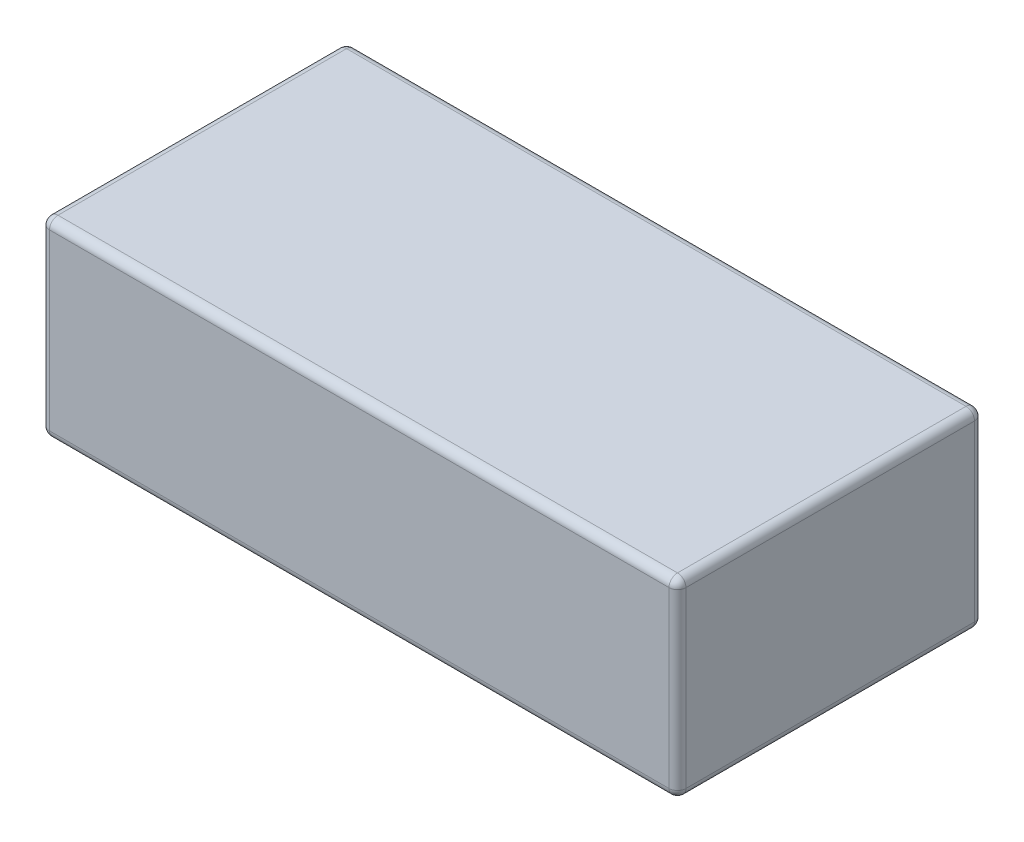
ISO-10303-21;
HEADER;
FILE_DESCRIPTION(('STEP AP214'),'2;1');
FILE_NAME('part.step','',(''),(''),'','','');
FILE_SCHEMA(('AUTOMOTIVE_DESIGN { 1 0 10303 214 1 1 1 1 }'));
ENDSEC;
DATA;
#1=APPLICATION_CONTEXT('core data for automotive mechanical design processes');
#2=APPLICATION_PROTOCOL_DEFINITION('international standard','automotive_design',2000,#1);
#3=PRODUCT_CONTEXT('',#1,'mechanical');
#4=PRODUCT('Part','Part','',(#3));
#5=PRODUCT_RELATED_PRODUCT_CATEGORY('part','',(#4));
#6=PRODUCT_DEFINITION_FORMATION('','',#4);
#7=PRODUCT_DEFINITION_CONTEXT('part definition',#1,'design');
#8=PRODUCT_DEFINITION('design','',#6,#7);
#9=PRODUCT_DEFINITION_SHAPE('','',#8);
#10=(LENGTH_UNIT() NAMED_UNIT(*) SI_UNIT(.MILLI.,.METRE.));
#11=(NAMED_UNIT(*) PLANE_ANGLE_UNIT() SI_UNIT($,.RADIAN.));
#12=(NAMED_UNIT(*) SI_UNIT($,.STERADIAN.) SOLID_ANGLE_UNIT());
#13=UNCERTAINTY_MEASURE_WITH_UNIT(LENGTH_MEASURE(1.E-05),#10,'distance_accuracy_value','');
#14=(GEOMETRIC_REPRESENTATION_CONTEXT(3) GLOBAL_UNCERTAINTY_ASSIGNED_CONTEXT((#13)) GLOBAL_UNIT_ASSIGNED_CONTEXT((#10,
#11,#12)) REPRESENTATION_CONTEXT('',''));
#15=CARTESIAN_POINT('',(0.,0.,0.));
#16=DIRECTION('',(0.,0.,1.));
#17=DIRECTION('',(1.,0.,0.));
#18=AXIS2_PLACEMENT_3D('',#15,#16,#17);
#19=CARTESIAN_POINT('',(75.,45.,36.));
#20=DIRECTION('',(-1.,0.,0.));
#21=DIRECTION('',(0.,0.,1.));
#22=AXIS2_PLACEMENT_3D('',#19,#20,#21);
#23=PLANE('',#22);
#24=DIRECTION('',(0.,0.,-1.));
#25=VECTOR('',#24,1.);
#26=CARTESIAN_POINT('',(75.,2.,-36.));
#27=LINE('',#26,#25);
#28=CARTESIAN_POINT('',(75.,2.,34.));
#29=VERTEX_POINT('',#28);
#30=CARTESIAN_POINT('',(75.,2.,-34.));
#31=VERTEX_POINT('',#30);
#32=EDGE_CURVE('E188',#29,#31,#27,.T.);
#33=ORIENTED_EDGE('',*,*,#32,.T.);
#34=DIRECTION('',(0.,-1.,0.));
#35=VECTOR('',#34,1.);
#36=CARTESIAN_POINT('',(75.,45.,-34.));
#37=LINE('',#36,#35);
#38=CARTESIAN_POINT('',(75.,43.,-34.));
#39=VERTEX_POINT('',#38);
#40=EDGE_CURVE('E190',#31,#39,#37,.F.);
#41=ORIENTED_EDGE('',*,*,#40,.T.);
#42=DIRECTION('',(0.,0.,-1.));
#43=VECTOR('',#42,1.);
#44=CARTESIAN_POINT('',(75.,43.,36.));
#45=LINE('',#44,#43);
#46=CARTESIAN_POINT('',(75.,43.,34.));
#47=VERTEX_POINT('',#46);
#48=EDGE_CURVE('E184',#39,#47,#45,.F.);
#49=ORIENTED_EDGE('',*,*,#48,.T.);
#50=DIRECTION('',(0.,-1.,0.));
#51=VECTOR('',#50,1.);
#52=CARTESIAN_POINT('',(75.,45.,34.));
#53=LINE('',#52,#51);
#54=EDGE_CURVE('E186',#47,#29,#53,.T.);
#55=ORIENTED_EDGE('',*,*,#54,.T.);
#56=EDGE_LOOP('',(#33,#41,#49,#55));
#57=FACE_BOUND('',#56,.T.);
#58=ADVANCED_FACE('F35',(#57),#23,.F.);
#59=CARTESIAN_POINT('',(-75.,45.,-36.));
#60=DIRECTION('',(0.,0.,1.));
#61=DIRECTION('',(1.,0.,0.));
#62=AXIS2_PLACEMENT_3D('',#59,#60,#61);
#63=PLANE('',#62);
#64=DIRECTION('',(-1.,0.,0.));
#65=VECTOR('',#64,1.);
#66=CARTESIAN_POINT('',(-75.,2.,-36.));
#67=LINE('',#66,#65);
#68=CARTESIAN_POINT('',(73.,2.,-36.));
#69=VERTEX_POINT('',#68);
#70=CARTESIAN_POINT('',(-73.,2.,-36.));
#71=VERTEX_POINT('',#70);
#72=EDGE_CURVE('E170',#69,#71,#67,.T.);
#73=ORIENTED_EDGE('',*,*,#72,.T.);
#74=DIRECTION('',(0.,-1.,0.));
#75=VECTOR('',#74,1.);
#76=CARTESIAN_POINT('',(-73.,45.,-36.));
#77=LINE('',#76,#75);
#78=CARTESIAN_POINT('',(-73.,43.,-36.));
#79=VERTEX_POINT('',#78);
#80=EDGE_CURVE('E172',#71,#79,#77,.F.);
#81=ORIENTED_EDGE('',*,*,#80,.T.);
#82=DIRECTION('',(-1.,0.,0.));
#83=VECTOR('',#82,1.);
#84=CARTESIAN_POINT('',(-75.,43.,-36.));
#85=LINE('',#84,#83);
#86=CARTESIAN_POINT('',(73.,43.,-36.));
#87=VERTEX_POINT('',#86);
#88=EDGE_CURVE('E166',#79,#87,#85,.F.);
#89=ORIENTED_EDGE('',*,*,#88,.T.);
#90=DIRECTION('',(0.,-1.,0.));
#91=VECTOR('',#90,1.);
#92=CARTESIAN_POINT('',(73.,45.,-36.));
#93=LINE('',#92,#91);
#94=EDGE_CURVE('E168',#87,#69,#93,.T.);
#95=ORIENTED_EDGE('',*,*,#94,.T.);
#96=EDGE_LOOP('',(#73,#81,#89,#95));
#97=FACE_BOUND('',#96,.T.);
#98=ADVANCED_FACE('F309',(#97),#63,.F.);
#99=CARTESIAN_POINT('',(-75.,45.,36.));
#100=DIRECTION('',(1.,0.,0.));
#101=DIRECTION('',(0.,0.,-1.));
#102=AXIS2_PLACEMENT_3D('',#99,#100,#101);
#103=PLANE('',#102);
#104=DIRECTION('',(0.,0.,1.));
#105=VECTOR('',#104,1.);
#106=CARTESIAN_POINT('',(-75.,43.,36.));
#107=LINE('',#106,#105);
#108=CARTESIAN_POINT('',(-75.,43.,34.));
#109=VERTEX_POINT('',#108);
#110=CARTESIAN_POINT('',(-75.,43.,-34.));
#111=VERTEX_POINT('',#110);
#112=EDGE_CURVE('E128',#109,#111,#107,.F.);
#113=ORIENTED_EDGE('',*,*,#112,.T.);
#114=DIRECTION('',(0.,-1.,0.));
#115=VECTOR('',#114,1.);
#116=CARTESIAN_POINT('',(-75.,45.,-34.));
#117=LINE('',#116,#115);
#118=CARTESIAN_POINT('',(-75.,2.,-34.));
#119=VERTEX_POINT('',#118);
#120=EDGE_CURVE('E164',#111,#119,#117,.T.);
#121=ORIENTED_EDGE('',*,*,#120,.T.);
#122=DIRECTION('',(0.,0.,1.));
#123=VECTOR('',#122,1.);
#124=CARTESIAN_POINT('',(-75.,2.,36.));
#125=LINE('',#124,#123);
#126=CARTESIAN_POINT('',(-75.,2.,34.));
#127=VERTEX_POINT('',#126);
#128=EDGE_CURVE('E131',#119,#127,#125,.T.);
#129=ORIENTED_EDGE('',*,*,#128,.T.);
#130=DIRECTION('',(0.,-1.,0.));
#131=VECTOR('',#130,1.);
#132=CARTESIAN_POINT('',(-75.,45.,34.));
#133=LINE('',#132,#131);
#134=EDGE_CURVE('E123',#127,#109,#133,.F.);
#135=ORIENTED_EDGE('',*,*,#134,.T.);
#136=EDGE_LOOP('',(#113,#121,#129,#135));
#137=FACE_BOUND('',#136,.T.);
#138=ADVANCED_FACE('F125',(#137),#103,.F.);
#139=CARTESIAN_POINT('',(-75.,45.,36.));
#140=DIRECTION('',(0.,0.,-1.));
#141=DIRECTION('',(-1.,0.,0.));
#142=AXIS2_PLACEMENT_3D('',#139,#140,#141);
#143=PLANE('',#142);
#144=DIRECTION('',(0.,-1.,0.));
#145=VECTOR('',#144,1.);
#146=CARTESIAN_POINT('',(-73.,45.,36.));
#147=LINE('',#146,#145);
#148=CARTESIAN_POINT('',(-73.,43.,36.));
#149=VERTEX_POINT('',#148);
#150=CARTESIAN_POINT('',(-73.,2.,36.));
#151=VERTEX_POINT('',#150);
#152=EDGE_CURVE('E141',#149,#151,#147,.T.);
#153=ORIENTED_EDGE('',*,*,#152,.T.);
#154=DIRECTION('',(1.,0.,0.));
#155=VECTOR('',#154,1.);
#156=CARTESIAN_POINT('',(75.,2.,36.));
#157=LINE('',#156,#155);
#158=CARTESIAN_POINT('',(73.,2.,36.));
#159=VERTEX_POINT('',#158);
#160=EDGE_CURVE('E199',#151,#159,#157,.T.);
#161=ORIENTED_EDGE('',*,*,#160,.T.);
#162=DIRECTION('',(0.,-1.,0.));
#163=VECTOR('',#162,1.);
#164=CARTESIAN_POINT('',(73.,45.,36.));
#165=LINE('',#164,#163);
#166=CARTESIAN_POINT('',(73.,43.,36.));
#167=VERTEX_POINT('',#166);
#168=EDGE_CURVE('E196',#159,#167,#165,.F.);
#169=ORIENTED_EDGE('',*,*,#168,.T.);
#170=DIRECTION('',(1.,0.,0.));
#171=VECTOR('',#170,1.);
#172=CARTESIAN_POINT('',(-75.,43.,36.));
#173=LINE('',#172,#171);
#174=EDGE_CURVE('E193',#167,#149,#173,.F.);
#175=ORIENTED_EDGE('',*,*,#174,.T.);
#176=EDGE_LOOP('',(#153,#161,#169,#175));
#177=FACE_BOUND('',#176,.T.);
#178=ADVANCED_FACE('F299',(#177),#143,.F.);
#179=CARTESIAN_POINT('',(0.,45.,0.));
#180=DIRECTION('',(0.,-1.,0.));
#181=DIRECTION('',(0.,0.,-1.));
#182=AXIS2_PLACEMENT_3D('',#179,#180,#181);
#183=PLANE('',#182);
#184=DIRECTION('',(1.,0.,0.));
#185=VECTOR('',#184,1.);
#186=CARTESIAN_POINT('',(0.,45.,34.));
#187=LINE('',#186,#185);
#188=CARTESIAN_POINT('',(-73.,45.,34.));
#189=VERTEX_POINT('',#188);
#190=CARTESIAN_POINT('',(73.,45.,34.));
#191=VERTEX_POINT('',#190);
#192=EDGE_CURVE('E201',#189,#191,#187,.T.);
#193=ORIENTED_EDGE('',*,*,#192,.T.);
#194=DIRECTION('',(0.,0.,-1.));
#195=VECTOR('',#194,1.);
#196=CARTESIAN_POINT('',(73.,45.,0.));
#197=LINE('',#196,#195);
#198=CARTESIAN_POINT('',(73.,45.,-34.));
#199=VERTEX_POINT('',#198);
#200=EDGE_CURVE('E11',#191,#199,#197,.T.);
#201=ORIENTED_EDGE('',*,*,#200,.T.);
#202=DIRECTION('',(-1.,0.,0.));
#203=VECTOR('',#202,1.);
#204=CARTESIAN_POINT('',(0.,45.,-34.));
#205=LINE('',#204,#203);
#206=CARTESIAN_POINT('',(-73.,45.,-34.));
#207=VERTEX_POINT('',#206);
#208=EDGE_CURVE('E44',#199,#207,#205,.T.);
#209=ORIENTED_EDGE('',*,*,#208,.T.);
#210=DIRECTION('',(0.,0.,1.));
#211=VECTOR('',#210,1.);
#212=CARTESIAN_POINT('',(-73.,45.,0.));
#213=LINE('',#212,#211);
#214=EDGE_CURVE('E203',#207,#189,#213,.T.);
#215=ORIENTED_EDGE('',*,*,#214,.T.);
#216=EDGE_LOOP('',(#193,#201,#209,#215));
#217=FACE_BOUND('',#216,.T.);
#218=ADVANCED_FACE('F301',(#217),#183,.F.);
#219=CARTESIAN_POINT('',(0.,0.,0.));
#220=DIRECTION('',(0.,-1.,0.));
#221=DIRECTION('',(0.,0.,-1.));
#222=AXIS2_PLACEMENT_3D('',#219,#220,#221);
#223=PLANE('',#222);
#224=DIRECTION('',(1.,0.,0.));
#225=VECTOR('',#224,1.);
#226=CARTESIAN_POINT('',(-75.,0.,34.));
#227=LINE('',#226,#225);
#228=CARTESIAN_POINT('',(73.,0.,34.));
#229=VERTEX_POINT('',#228);
#230=CARTESIAN_POINT('',(-73.,0.,34.));
#231=VERTEX_POINT('',#230);
#232=EDGE_CURVE('E175',#229,#231,#227,.F.);
#233=ORIENTED_EDGE('',*,*,#232,.T.);
#234=DIRECTION('',(0.,0.,1.));
#235=VECTOR('',#234,1.);
#236=CARTESIAN_POINT('',(-73.,0.,-36.));
#237=LINE('',#236,#235);
#238=CARTESIAN_POINT('',(-73.,0.,-34.));
#239=VERTEX_POINT('',#238);
#240=EDGE_CURVE('E181',#231,#239,#237,.F.);
#241=ORIENTED_EDGE('',*,*,#240,.T.);
#242=DIRECTION('',(-1.,0.,0.));
#243=VECTOR('',#242,1.);
#244=CARTESIAN_POINT('',(75.,0.,-34.));
#245=LINE('',#244,#243);
#246=CARTESIAN_POINT('',(73.,0.,-34.));
#247=VERTEX_POINT('',#246);
#248=EDGE_CURVE('E179',#239,#247,#245,.F.);
#249=ORIENTED_EDGE('',*,*,#248,.T.);
#250=DIRECTION('',(0.,0.,-1.));
#251=VECTOR('',#250,1.);
#252=CARTESIAN_POINT('',(73.,0.,36.));
#253=LINE('',#252,#251);
#254=EDGE_CURVE('E177',#247,#229,#253,.F.);
#255=ORIENTED_EDGE('',*,*,#254,.T.);
#256=EDGE_LOOP('',(#233,#241,#249,#255));
#257=FACE_BOUND('',#256,.T.);
#258=ADVANCED_FACE('F269',(#257),#223,.T.);
#259=CARTESIAN_POINT('',(73.,45.,34.));
#260=DIRECTION('',(0.,-1.,0.));
#261=DIRECTION('',(0.,0.,-1.));
#262=AXIS2_PLACEMENT_3D('',#259,#260,#261);
#263=CYLINDRICAL_SURFACE('',#262,2.);
#264=CARTESIAN_POINT('',(73.,43.,34.));
#265=DIRECTION('',(0.,1.,0.));
#266=DIRECTION('',(0.,0.,1.));
#267=AXIS2_PLACEMENT_3D('',#264,#265,#266);
#268=CIRCLE('',#267,2.);
#269=EDGE_CURVE('E39',#167,#47,#268,.T.);
#270=ORIENTED_EDGE('',*,*,#269,.F.);
#271=ORIENTED_EDGE('',*,*,#168,.F.);
#272=CARTESIAN_POINT('',(73.,2.,34.));
#273=DIRECTION('',(0.,-1.,0.));
#274=DIRECTION('',(0.,0.,-1.));
#275=AXIS2_PLACEMENT_3D('',#272,#273,#274);
#276=CIRCLE('',#275,2.);
#277=EDGE_CURVE('E161',#29,#159,#276,.T.);
#278=ORIENTED_EDGE('',*,*,#277,.F.);
#279=ORIENTED_EDGE('',*,*,#54,.F.);
#280=EDGE_LOOP('',(#270,#271,#278,#279));
#281=FACE_BOUND('',#280,.T.);
#282=ADVANCED_FACE('F37',(#281),#263,.T.);
#283=CARTESIAN_POINT('',(73.,43.,34.));
#284=DIRECTION('',(0.,0.,1.));
#285=DIRECTION('',(1.,0.,0.));
#286=AXIS2_PLACEMENT_3D('',#283,#284,#285);
#287=SPHERICAL_SURFACE('',#286,2.);
#288=CARTESIAN_POINT('',(73.,43.,34.));
#289=DIRECTION('',(1.,0.,0.));
#290=DIRECTION('',(0.,0.,-1.));
#291=AXIS2_PLACEMENT_3D('',#288,#289,#290);
#292=CIRCLE('',#291,2.);
#293=EDGE_CURVE('E247',#167,#191,#292,.F.);
#294=ORIENTED_EDGE('',*,*,#293,.F.);
#295=ORIENTED_EDGE('',*,*,#269,.T.);
#296=CARTESIAN_POINT('',(73.,43.,34.));
#297=DIRECTION('',(0.,0.,1.));
#298=DIRECTION('',(1.,0.,0.));
#299=AXIS2_PLACEMENT_3D('',#296,#297,#298);
#300=CIRCLE('',#299,2.);
#301=EDGE_CURVE('E250',#191,#47,#300,.F.);
#302=ORIENTED_EDGE('',*,*,#301,.F.);
#303=EDGE_LOOP('',(#294,#295,#302));
#304=FACE_BOUND('',#303,.T.);
#305=ADVANCED_FACE('F294',(#304),#287,.T.);
#306=CARTESIAN_POINT('',(73.,2.,34.));
#307=DIRECTION('',(0.,0.,1.));
#308=DIRECTION('',(1.,0.,0.));
#309=AXIS2_PLACEMENT_3D('',#306,#307,#308);
#310=SPHERICAL_SURFACE('',#309,2.);
#311=CARTESIAN_POINT('',(73.,2.,34.));
#312=DIRECTION('',(0.,0.,1.));
#313=DIRECTION('',(1.,0.,0.));
#314=AXIS2_PLACEMENT_3D('',#311,#312,#313);
#315=CIRCLE('',#314,2.);
#316=EDGE_CURVE('E241',#29,#229,#315,.F.);
#317=ORIENTED_EDGE('',*,*,#316,.F.);
#318=ORIENTED_EDGE('',*,*,#277,.T.);
#319=CARTESIAN_POINT('',(73.,2.,34.));
#320=DIRECTION('',(1.,0.,0.));
#321=DIRECTION('',(0.,0.,-1.));
#322=AXIS2_PLACEMENT_3D('',#319,#320,#321);
#323=CIRCLE('',#322,2.);
#324=EDGE_CURVE('E244',#229,#159,#323,.F.);
#325=ORIENTED_EDGE('',*,*,#324,.F.);
#326=EDGE_LOOP('',(#317,#318,#325));
#327=FACE_BOUND('',#326,.T.);
#328=ADVANCED_FACE('F257',(#327),#310,.T.);
#329=CARTESIAN_POINT('',(73.,43.,0.));
#330=DIRECTION('',(0.,0.,-1.));
#331=DIRECTION('',(-1.,0.,0.));
#332=AXIS2_PLACEMENT_3D('',#329,#330,#331);
#333=CYLINDRICAL_SURFACE('',#332,2.);
#334=ORIENTED_EDGE('',*,*,#301,.T.);
#335=ORIENTED_EDGE('',*,*,#48,.F.);
#336=CARTESIAN_POINT('',(73.,43.,-34.));
#337=DIRECTION('',(0.,0.,-1.));
#338=DIRECTION('',(-1.,0.,0.));
#339=AXIS2_PLACEMENT_3D('',#336,#337,#338);
#340=CIRCLE('',#339,2.);
#341=EDGE_CURVE('E236',#199,#39,#340,.T.);
#342=ORIENTED_EDGE('',*,*,#341,.F.);
#343=ORIENTED_EDGE('',*,*,#200,.F.);
#344=EDGE_LOOP('',(#334,#335,#342,#343));
#345=FACE_BOUND('',#344,.T.);
#346=ADVANCED_FACE('F288',(#345),#333,.T.);
#347=CARTESIAN_POINT('',(0.,43.,34.));
#348=DIRECTION('',(1.,0.,0.));
#349=DIRECTION('',(0.,0.,-1.));
#350=AXIS2_PLACEMENT_3D('',#347,#348,#349);
#351=CYLINDRICAL_SURFACE('',#350,2.);
#352=ORIENTED_EDGE('',*,*,#293,.T.);
#353=ORIENTED_EDGE('',*,*,#192,.F.);
#354=CARTESIAN_POINT('',(-73.,43.,34.));
#355=DIRECTION('',(-1.,0.,0.));
#356=DIRECTION('',(0.,0.,1.));
#357=AXIS2_PLACEMENT_3D('',#354,#355,#356);
#358=CIRCLE('',#357,2.);
#359=EDGE_CURVE('E145',#149,#189,#358,.T.);
#360=ORIENTED_EDGE('',*,*,#359,.F.);
#361=ORIENTED_EDGE('',*,*,#174,.F.);
#362=EDGE_LOOP('',(#352,#353,#360,#361));
#363=FACE_BOUND('',#362,.T.);
#364=ADVANCED_FACE('F297',(#363),#351,.T.);
#365=CARTESIAN_POINT('',(-73.,45.,34.));
#366=DIRECTION('',(0.,-1.,0.));
#367=DIRECTION('',(0.,0.,-1.));
#368=AXIS2_PLACEMENT_3D('',#365,#366,#367);
#369=CYLINDRICAL_SURFACE('',#368,2.);
#370=CARTESIAN_POINT('',(-73.,2.,34.));
#371=DIRECTION('',(0.,-1.,0.));
#372=DIRECTION('',(0.,0.,-1.));
#373=AXIS2_PLACEMENT_3D('',#370,#371,#372);
#374=CIRCLE('',#373,2.);
#375=EDGE_CURVE('E146',#151,#127,#374,.T.);
#376=ORIENTED_EDGE('',*,*,#375,.F.);
#377=ORIENTED_EDGE('',*,*,#152,.F.);
#378=CARTESIAN_POINT('',(-73.,43.,34.));
#379=DIRECTION('',(0.,1.,0.));
#380=DIRECTION('',(0.,0.,1.));
#381=AXIS2_PLACEMENT_3D('',#378,#379,#380);
#382=CIRCLE('',#381,2.);
#383=EDGE_CURVE('E138',#109,#149,#382,.T.);
#384=ORIENTED_EDGE('',*,*,#383,.F.);
#385=ORIENTED_EDGE('',*,*,#134,.F.);
#386=EDGE_LOOP('',(#376,#377,#384,#385));
#387=FACE_BOUND('',#386,.T.);
#388=ADVANCED_FACE('F140',(#387),#369,.T.);
#389=CARTESIAN_POINT('',(-75.,2.,34.));
#390=DIRECTION('',(-1.,0.,0.));
#391=DIRECTION('',(0.,0.,1.));
#392=AXIS2_PLACEMENT_3D('',#389,#390,#391);
#393=CYLINDRICAL_SURFACE('',#392,2.);
#394=ORIENTED_EDGE('',*,*,#324,.T.);
#395=ORIENTED_EDGE('',*,*,#160,.F.);
#396=CARTESIAN_POINT('',(-73.,2.,34.));
#397=DIRECTION('',(-1.,0.,0.));
#398=DIRECTION('',(0.,0.,1.));
#399=AXIS2_PLACEMENT_3D('',#396,#397,#398);
#400=CIRCLE('',#399,2.);
#401=EDGE_CURVE('E231',#231,#151,#400,.T.);
#402=ORIENTED_EDGE('',*,*,#401,.F.);
#403=ORIENTED_EDGE('',*,*,#232,.F.);
#404=EDGE_LOOP('',(#394,#395,#402,#403));
#405=FACE_BOUND('',#404,.T.);
#406=ADVANCED_FACE('F265',(#405),#393,.T.);
#407=CARTESIAN_POINT('',(73.,2.,36.));
#408=DIRECTION('',(0.,0.,1.));
#409=DIRECTION('',(1.,0.,0.));
#410=AXIS2_PLACEMENT_3D('',#407,#408,#409);
#411=CYLINDRICAL_SURFACE('',#410,2.);
#412=ORIENTED_EDGE('',*,*,#316,.T.);
#413=ORIENTED_EDGE('',*,*,#254,.F.);
#414=CARTESIAN_POINT('',(73.,2.,-34.));
#415=DIRECTION('',(0.,0.,-1.));
#416=DIRECTION('',(-1.,0.,0.));
#417=AXIS2_PLACEMENT_3D('',#414,#415,#416);
#418=CIRCLE('',#417,2.);
#419=EDGE_CURVE('E228',#31,#247,#418,.T.);
#420=ORIENTED_EDGE('',*,*,#419,.F.);
#421=ORIENTED_EDGE('',*,*,#32,.F.);
#422=EDGE_LOOP('',(#412,#413,#420,#421));
#423=FACE_BOUND('',#422,.T.);
#424=ADVANCED_FACE('F275',(#423),#411,.T.);
#425=CARTESIAN_POINT('',(73.,45.,-34.));
#426=DIRECTION('',(0.,-1.,0.));
#427=DIRECTION('',(0.,0.,-1.));
#428=AXIS2_PLACEMENT_3D('',#425,#426,#427);
#429=CYLINDRICAL_SURFACE('',#428,2.);
#430=CARTESIAN_POINT('',(73.,43.,-34.));
#431=DIRECTION('',(0.,1.,0.));
#432=DIRECTION('',(0.,0.,1.));
#433=AXIS2_PLACEMENT_3D('',#430,#431,#432);
#434=CIRCLE('',#433,2.);
#435=EDGE_CURVE('E238',#39,#87,#434,.T.);
#436=ORIENTED_EDGE('',*,*,#435,.F.);
#437=ORIENTED_EDGE('',*,*,#40,.F.);
#438=CARTESIAN_POINT('',(73.,2.,-34.));
#439=DIRECTION('',(0.,-1.,0.));
#440=DIRECTION('',(0.,0.,-1.));
#441=AXIS2_PLACEMENT_3D('',#438,#439,#440);
#442=CIRCLE('',#441,2.);
#443=EDGE_CURVE('E225',#69,#31,#442,.T.);
#444=ORIENTED_EDGE('',*,*,#443,.F.);
#445=ORIENTED_EDGE('',*,*,#94,.F.);
#446=EDGE_LOOP('',(#436,#437,#444,#445));
#447=FACE_BOUND('',#446,.T.);
#448=ADVANCED_FACE('F281',(#447),#429,.T.);
#449=CARTESIAN_POINT('',(73.,43.,-34.));
#450=DIRECTION('',(0.,0.,1.));
#451=DIRECTION('',(1.,0.,0.));
#452=AXIS2_PLACEMENT_3D('',#449,#450,#451);
#453=SPHERICAL_SURFACE('',#452,2.);
#454=ORIENTED_EDGE('',*,*,#341,.T.);
#455=ORIENTED_EDGE('',*,*,#435,.T.);
#456=CARTESIAN_POINT('',(73.,43.,-34.));
#457=DIRECTION('',(1.,0.,0.));
#458=DIRECTION('',(0.,1.,0.));
#459=AXIS2_PLACEMENT_3D('',#456,#457,#458);
#460=CIRCLE('',#459,2.);
#461=EDGE_CURVE('E152',#199,#87,#460,.F.);
#462=ORIENTED_EDGE('',*,*,#461,.F.);
#463=EDGE_LOOP('',(#454,#455,#462));
#464=FACE_BOUND('',#463,.T.);
#465=ADVANCED_FACE('F355',(#464),#453,.T.);
#466=CARTESIAN_POINT('',(-73.,43.,34.));
#467=DIRECTION('',(0.,0.,1.));
#468=DIRECTION('',(1.,0.,0.));
#469=AXIS2_PLACEMENT_3D('',#466,#467,#468);
#470=SPHERICAL_SURFACE('',#469,2.);
#471=ORIENTED_EDGE('',*,*,#383,.T.);
#472=ORIENTED_EDGE('',*,*,#359,.T.);
#473=CARTESIAN_POINT('',(-73.,43.,34.));
#474=DIRECTION('',(0.,0.,1.));
#475=DIRECTION('',(1.,0.,0.));
#476=AXIS2_PLACEMENT_3D('',#473,#474,#475);
#477=CIRCLE('',#476,2.);
#478=EDGE_CURVE('E149',#109,#189,#477,.F.);
#479=ORIENTED_EDGE('',*,*,#478,.F.);
#480=EDGE_LOOP('',(#471,#472,#479));
#481=FACE_BOUND('',#480,.T.);
#482=ADVANCED_FACE('F150',(#481),#470,.T.);
#483=CARTESIAN_POINT('',(-73.,2.,34.));
#484=DIRECTION('',(0.,0.,1.));
#485=DIRECTION('',(1.,0.,0.));
#486=AXIS2_PLACEMENT_3D('',#483,#484,#485);
#487=SPHERICAL_SURFACE('',#486,2.);
#488=ORIENTED_EDGE('',*,*,#401,.T.);
#489=ORIENTED_EDGE('',*,*,#375,.T.);
#490=CARTESIAN_POINT('',(-73.,2.,34.));
#491=DIRECTION('',(0.,0.,1.));
#492=DIRECTION('',(1.,0.,0.));
#493=AXIS2_PLACEMENT_3D('',#490,#491,#492);
#494=CIRCLE('',#493,2.);
#495=EDGE_CURVE('E153',#231,#127,#494,.F.);
#496=ORIENTED_EDGE('',*,*,#495,.F.);
#497=EDGE_LOOP('',(#488,#489,#496));
#498=FACE_BOUND('',#497,.T.);
#499=ADVANCED_FACE('F348',(#498),#487,.T.);
#500=CARTESIAN_POINT('',(73.,2.,-34.));
#501=DIRECTION('',(0.,0.,1.));
#502=DIRECTION('',(1.,0.,0.));
#503=AXIS2_PLACEMENT_3D('',#500,#501,#502);
#504=SPHERICAL_SURFACE('',#503,2.);
#505=ORIENTED_EDGE('',*,*,#443,.T.);
#506=ORIENTED_EDGE('',*,*,#419,.T.);
#507=CARTESIAN_POINT('',(73.,2.,-34.));
#508=DIRECTION('',(1.,0.,0.));
#509=DIRECTION('',(0.,0.,-1.));
#510=AXIS2_PLACEMENT_3D('',#507,#508,#509);
#511=CIRCLE('',#510,2.);
#512=EDGE_CURVE('E219',#69,#247,#511,.F.);
#513=ORIENTED_EDGE('',*,*,#512,.F.);
#514=EDGE_LOOP('',(#505,#506,#513));
#515=FACE_BOUND('',#514,.T.);
#516=ADVANCED_FACE('F345',(#515),#504,.T.);
#517=CARTESIAN_POINT('',(0.,43.,-34.));
#518=DIRECTION('',(-1.,0.,0.));
#519=DIRECTION('',(0.,0.,1.));
#520=AXIS2_PLACEMENT_3D('',#517,#518,#519);
#521=CYLINDRICAL_SURFACE('',#520,2.);
#522=ORIENTED_EDGE('',*,*,#461,.T.);
#523=ORIENTED_EDGE('',*,*,#88,.F.);
#524=CARTESIAN_POINT('',(-73.,43.,-34.));
#525=DIRECTION('',(-1.,0.,0.));
#526=DIRECTION('',(0.,0.,1.));
#527=AXIS2_PLACEMENT_3D('',#524,#525,#526);
#528=CIRCLE('',#527,2.);
#529=EDGE_CURVE('E216',#207,#79,#528,.T.);
#530=ORIENTED_EDGE('',*,*,#529,.F.);
#531=ORIENTED_EDGE('',*,*,#208,.F.);
#532=EDGE_LOOP('',(#522,#523,#530,#531));
#533=FACE_BOUND('',#532,.T.);
#534=ADVANCED_FACE('F342',(#533),#521,.T.);
#535=CARTESIAN_POINT('',(-73.,43.,0.));
#536=DIRECTION('',(0.,0.,1.));
#537=DIRECTION('',(1.,0.,0.));
#538=AXIS2_PLACEMENT_3D('',#535,#536,#537);
#539=CYLINDRICAL_SURFACE('',#538,2.);
#540=ORIENTED_EDGE('',*,*,#478,.T.);
#541=ORIENTED_EDGE('',*,*,#214,.F.);
#542=CARTESIAN_POINT('',(-73.,43.,-34.));
#543=DIRECTION('',(0.,0.,-1.));
#544=DIRECTION('',(0.,1.,0.));
#545=AXIS2_PLACEMENT_3D('',#542,#543,#544);
#546=CIRCLE('',#545,2.);
#547=EDGE_CURVE('E157',#111,#207,#546,.T.);
#548=ORIENTED_EDGE('',*,*,#547,.F.);
#549=ORIENTED_EDGE('',*,*,#112,.F.);
#550=EDGE_LOOP('',(#540,#541,#548,#549));
#551=FACE_BOUND('',#550,.T.);
#552=ADVANCED_FACE('F155',(#551),#539,.T.);
#553=CARTESIAN_POINT('',(-73.,2.,36.));
#554=DIRECTION('',(0.,0.,-1.));
#555=DIRECTION('',(-1.,0.,0.));
#556=AXIS2_PLACEMENT_3D('',#553,#554,#555);
#557=CYLINDRICAL_SURFACE('',#556,2.);
#558=ORIENTED_EDGE('',*,*,#495,.T.);
#559=ORIENTED_EDGE('',*,*,#128,.F.);
#560=CARTESIAN_POINT('',(-73.,2.,-34.));
#561=DIRECTION('',(0.,0.,-1.));
#562=DIRECTION('',(-1.,0.,0.));
#563=AXIS2_PLACEMENT_3D('',#560,#561,#562);
#564=CIRCLE('',#563,2.);
#565=EDGE_CURVE('E212',#239,#119,#564,.T.);
#566=ORIENTED_EDGE('',*,*,#565,.F.);
#567=ORIENTED_EDGE('',*,*,#240,.F.);
#568=EDGE_LOOP('',(#558,#559,#566,#567));
#569=FACE_BOUND('',#568,.T.);
#570=ADVANCED_FACE('F335',(#569),#557,.T.);
#571=CARTESIAN_POINT('',(-75.,2.,-34.));
#572=DIRECTION('',(1.,0.,0.));
#573=DIRECTION('',(0.,0.,-1.));
#574=AXIS2_PLACEMENT_3D('',#571,#572,#573);
#575=CYLINDRICAL_SURFACE('',#574,2.);
#576=ORIENTED_EDGE('',*,*,#512,.T.);
#577=ORIENTED_EDGE('',*,*,#248,.F.);
#578=CARTESIAN_POINT('',(-73.,2.,-34.));
#579=DIRECTION('',(-1.,0.,0.));
#580=DIRECTION('',(0.,0.,1.));
#581=AXIS2_PLACEMENT_3D('',#578,#579,#580);
#582=CIRCLE('',#581,2.);
#583=EDGE_CURVE('E210',#71,#239,#582,.T.);
#584=ORIENTED_EDGE('',*,*,#583,.F.);
#585=ORIENTED_EDGE('',*,*,#72,.F.);
#586=EDGE_LOOP('',(#576,#577,#584,#585));
#587=FACE_BOUND('',#586,.T.);
#588=ADVANCED_FACE('F331',(#587),#575,.T.);
#589=CARTESIAN_POINT('',(-73.,43.,-34.));
#590=DIRECTION('',(0.,0.,1.));
#591=DIRECTION('',(1.,0.,0.));
#592=AXIS2_PLACEMENT_3D('',#589,#590,#591);
#593=SPHERICAL_SURFACE('',#592,2.);
#594=ORIENTED_EDGE('',*,*,#547,.T.);
#595=ORIENTED_EDGE('',*,*,#529,.T.);
#596=CARTESIAN_POINT('',(-73.,43.,-34.));
#597=DIRECTION('',(0.,1.,0.));
#598=DIRECTION('',(0.,0.,1.));
#599=AXIS2_PLACEMENT_3D('',#596,#597,#598);
#600=CIRCLE('',#599,2.);
#601=EDGE_CURVE('E208',#111,#79,#600,.F.);
#602=ORIENTED_EDGE('',*,*,#601,.F.);
#603=EDGE_LOOP('',(#594,#595,#602));
#604=FACE_BOUND('',#603,.T.);
#605=ADVANCED_FACE('F327',(#604),#593,.T.);
#606=CARTESIAN_POINT('',(-73.,2.,-34.));
#607=DIRECTION('',(0.,0.,1.));
#608=DIRECTION('',(1.,0.,0.));
#609=AXIS2_PLACEMENT_3D('',#606,#607,#608);
#610=SPHERICAL_SURFACE('',#609,2.);
#611=ORIENTED_EDGE('',*,*,#583,.T.);
#612=ORIENTED_EDGE('',*,*,#565,.T.);
#613=CARTESIAN_POINT('',(-73.,2.,-34.));
#614=DIRECTION('',(0.,-1.,0.));
#615=DIRECTION('',(0.,0.,-1.));
#616=AXIS2_PLACEMENT_3D('',#613,#614,#615);
#617=CIRCLE('',#616,2.);
#618=EDGE_CURVE('E206',#71,#119,#617,.F.);
#619=ORIENTED_EDGE('',*,*,#618,.F.);
#620=EDGE_LOOP('',(#611,#612,#619));
#621=FACE_BOUND('',#620,.T.);
#622=ADVANCED_FACE('F323',(#621),#610,.T.);
#623=CARTESIAN_POINT('',(-73.,45.,-34.));
#624=DIRECTION('',(0.,-1.,0.));
#625=DIRECTION('',(0.,0.,-1.));
#626=AXIS2_PLACEMENT_3D('',#623,#624,#625);
#627=CYLINDRICAL_SURFACE('',#626,2.);
#628=ORIENTED_EDGE('',*,*,#601,.T.);
#629=ORIENTED_EDGE('',*,*,#80,.F.);
#630=ORIENTED_EDGE('',*,*,#618,.T.);
#631=ORIENTED_EDGE('',*,*,#120,.F.);
#632=EDGE_LOOP('',(#628,#629,#630,#631));
#633=FACE_BOUND('',#632,.T.);
#634=ADVANCED_FACE('F320',(#633),#627,.T.);
#635=CLOSED_SHELL('',(#58,#98,#138,#178,#218,#258,#282,#305,#328,#346,#364,#388,#406,#424,#448,
#465,#482,#499,#516,#534,#552,#570,#588,#605,#622,#634));
#636=MANIFOLD_SOLID_BREP('B2',#635);
#637=ADVANCED_BREP_SHAPE_REPRESENTATION('',(#18,#636),#14);
#638=SHAPE_DEFINITION_REPRESENTATION(#9,#637);
ENDSEC;
END-ISO-10303-21;
